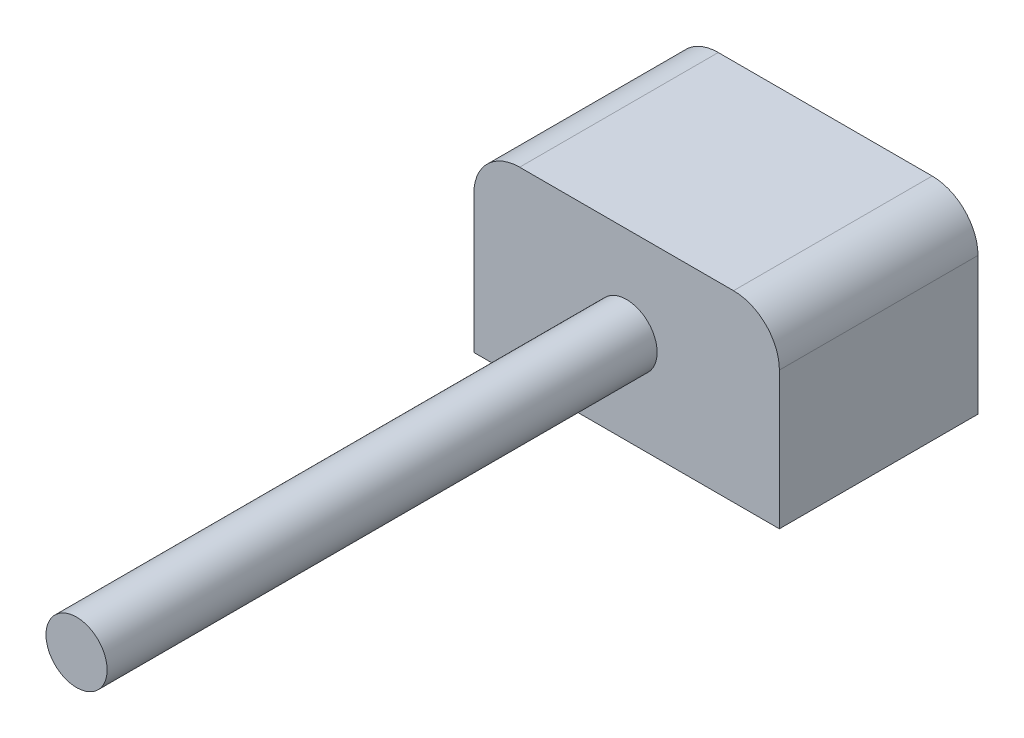
ISO-10303-21;
HEADER;
FILE_DESCRIPTION(('STEP AP214'),'2;1');
FILE_NAME('part.step','',(''),(''),'','','');
FILE_SCHEMA(('AUTOMOTIVE_DESIGN { 1 0 10303 214 1 1 1 1 }'));
ENDSEC;
DATA;
#1=APPLICATION_CONTEXT('core data for automotive mechanical design processes');
#2=APPLICATION_PROTOCOL_DEFINITION('international standard','automotive_design',2000,#1);
#3=PRODUCT_CONTEXT('',#1,'mechanical');
#4=PRODUCT('Part','Part','',(#3));
#5=PRODUCT_RELATED_PRODUCT_CATEGORY('part','',(#4));
#6=PRODUCT_DEFINITION_FORMATION('','',#4);
#7=PRODUCT_DEFINITION_CONTEXT('part definition',#1,'design');
#8=PRODUCT_DEFINITION('design','',#6,#7);
#9=PRODUCT_DEFINITION_SHAPE('','',#8);
#10=(LENGTH_UNIT() NAMED_UNIT(*) SI_UNIT(.MILLI.,.METRE.));
#11=(NAMED_UNIT(*) PLANE_ANGLE_UNIT() SI_UNIT($,.RADIAN.));
#12=(NAMED_UNIT(*) SI_UNIT($,.STERADIAN.) SOLID_ANGLE_UNIT());
#13=UNCERTAINTY_MEASURE_WITH_UNIT(LENGTH_MEASURE(1.E-05),#10,'distance_accuracy_value','');
#14=(GEOMETRIC_REPRESENTATION_CONTEXT(3) GLOBAL_UNCERTAINTY_ASSIGNED_CONTEXT((#13)) GLOBAL_UNIT_ASSIGNED_CONTEXT((#10,
#11,#12)) REPRESENTATION_CONTEXT('',''));
#15=CARTESIAN_POINT('',(0.,0.,0.));
#16=DIRECTION('',(0.,0.,1.));
#17=DIRECTION('',(1.,0.,0.));
#18=AXIS2_PLACEMENT_3D('',#15,#16,#17);
#19=CARTESIAN_POINT('',(-100.,60.,130.));
#20=DIRECTION('',(1.,0.,0.));
#21=DIRECTION('',(0.,1.,0.));
#22=AXIS2_PLACEMENT_3D('',#19,#20,#21);
#23=PLANE('',#22);
#24=DIRECTION('',(0.,-1.,0.));
#25=VECTOR('',#24,1.);
#26=CARTESIAN_POINT('',(-100.,60.,130.));
#27=LINE('',#26,#25);
#28=CARTESIAN_POINT('',(-100.,30.,130.));
#29=VERTEX_POINT('',#28);
#30=CARTESIAN_POINT('',(-100.,-60.,130.));
#31=VERTEX_POINT('',#30);
#32=EDGE_CURVE('E97',#29,#31,#27,.T.);
#33=ORIENTED_EDGE('',*,*,#32,.F.);
#34=DIRECTION('',(0.,0.,-1.));
#35=VECTOR('',#34,1.);
#36=CARTESIAN_POINT('',(-100.,30.,130.));
#37=LINE('',#36,#35);
#38=CARTESIAN_POINT('',(-100.,30.,0.));
#39=VERTEX_POINT('',#38);
#40=EDGE_CURVE('E13',#29,#39,#37,.T.);
#41=ORIENTED_EDGE('',*,*,#40,.T.);
#42=DIRECTION('',(0.,-1.,0.));
#43=VECTOR('',#42,1.);
#44=CARTESIAN_POINT('',(-100.,60.,0.));
#45=LINE('',#44,#43);
#46=CARTESIAN_POINT('',(-100.,-60.,0.));
#47=VERTEX_POINT('',#46);
#48=EDGE_CURVE('E116',#39,#47,#45,.T.);
#49=ORIENTED_EDGE('',*,*,#48,.T.);
#50=DIRECTION('',(0.,0.,-1.));
#51=VECTOR('',#50,1.);
#52=CARTESIAN_POINT('',(-100.,-60.,130.));
#53=LINE('',#52,#51);
#54=EDGE_CURVE('E110',#31,#47,#53,.T.);
#55=ORIENTED_EDGE('',*,*,#54,.F.);
#56=EDGE_LOOP('',(#33,#41,#49,#55));
#57=FACE_BOUND('',#56,.T.);
#58=ADVANCED_FACE('F44',(#57),#23,.F.);
#59=CARTESIAN_POINT('',(100.,-60.,130.));
#60=DIRECTION('',(0.,1.,0.));
#61=DIRECTION('',(-1.,0.,0.));
#62=AXIS2_PLACEMENT_3D('',#59,#60,#61);
#63=PLANE('',#62);
#64=DIRECTION('',(1.,0.,0.));
#65=VECTOR('',#64,1.);
#66=CARTESIAN_POINT('',(100.,-60.,0.));
#67=LINE('',#66,#65);
#68=CARTESIAN_POINT('',(100.,-60.,0.));
#69=VERTEX_POINT('',#68);
#70=EDGE_CURVE('E152',#47,#69,#67,.T.);
#71=ORIENTED_EDGE('',*,*,#70,.T.);
#72=DIRECTION('',(0.,0.,-1.));
#73=VECTOR('',#72,1.);
#74=CARTESIAN_POINT('',(100.,-60.,130.));
#75=LINE('',#74,#73);
#76=CARTESIAN_POINT('',(100.,-60.,130.));
#77=VERTEX_POINT('',#76);
#78=EDGE_CURVE('E112',#77,#69,#75,.T.);
#79=ORIENTED_EDGE('',*,*,#78,.F.);
#80=DIRECTION('',(1.,0.,0.));
#81=VECTOR('',#80,1.);
#82=CARTESIAN_POINT('',(100.,-60.,130.));
#83=LINE('',#82,#81);
#84=EDGE_CURVE('E100',#31,#77,#83,.T.);
#85=ORIENTED_EDGE('',*,*,#84,.F.);
#86=ORIENTED_EDGE('',*,*,#54,.T.);
#87=EDGE_LOOP('',(#71,#79,#85,#86));
#88=FACE_BOUND('',#87,.T.);
#89=ADVANCED_FACE('F109',(#88),#63,.F.);
#90=CARTESIAN_POINT('',(100.,60.,130.));
#91=DIRECTION('',(-1.,0.,0.));
#92=DIRECTION('',(0.,-1.,0.));
#93=AXIS2_PLACEMENT_3D('',#90,#91,#92);
#94=PLANE('',#93);
#95=DIRECTION('',(0.,1.,0.));
#96=VECTOR('',#95,1.);
#97=CARTESIAN_POINT('',(100.,60.,0.));
#98=LINE('',#97,#96);
#99=CARTESIAN_POINT('',(100.,30.,0.));
#100=VERTEX_POINT('',#99);
#101=EDGE_CURVE('E150',#69,#100,#98,.T.);
#102=ORIENTED_EDGE('',*,*,#101,.T.);
#103=DIRECTION('',(0.,0.,-1.));
#104=VECTOR('',#103,1.);
#105=CARTESIAN_POINT('',(100.,30.,130.));
#106=LINE('',#105,#104);
#107=CARTESIAN_POINT('',(100.,30.,130.));
#108=VERTEX_POINT('',#107);
#109=EDGE_CURVE('E67',#100,#108,#106,.F.);
#110=ORIENTED_EDGE('',*,*,#109,.T.);
#111=DIRECTION('',(0.,1.,0.));
#112=VECTOR('',#111,1.);
#113=CARTESIAN_POINT('',(100.,60.,130.));
#114=LINE('',#113,#112);
#115=EDGE_CURVE('E113',#77,#108,#114,.T.);
#116=ORIENTED_EDGE('',*,*,#115,.F.);
#117=ORIENTED_EDGE('',*,*,#78,.T.);
#118=EDGE_LOOP('',(#102,#110,#116,#117));
#119=FACE_BOUND('',#118,.T.);
#120=ADVANCED_FACE('F151',(#119),#94,.F.);
#121=CARTESIAN_POINT('',(100.,60.,130.));
#122=DIRECTION('',(0.,-1.,0.));
#123=DIRECTION('',(1.,0.,0.));
#124=AXIS2_PLACEMENT_3D('',#121,#122,#123);
#125=PLANE('',#124);
#126=DIRECTION('',(-1.,0.,0.));
#127=VECTOR('',#126,1.);
#128=CARTESIAN_POINT('',(100.,60.,130.));
#129=LINE('',#128,#127);
#130=CARTESIAN_POINT('',(70.,60.,130.));
#131=VERTEX_POINT('',#130);
#132=CARTESIAN_POINT('',(-70.,60.,130.));
#133=VERTEX_POINT('',#132);
#134=EDGE_CURVE('E123',#131,#133,#129,.T.);
#135=ORIENTED_EDGE('',*,*,#134,.F.);
#136=DIRECTION('',(0.,0.,-1.));
#137=VECTOR('',#136,1.);
#138=CARTESIAN_POINT('',(70.,60.,130.));
#139=LINE('',#138,#137);
#140=CARTESIAN_POINT('',(70.,60.,0.));
#141=VERTEX_POINT('',#140);
#142=EDGE_CURVE('E128',#131,#141,#139,.T.);
#143=ORIENTED_EDGE('',*,*,#142,.T.);
#144=DIRECTION('',(-1.,0.,0.));
#145=VECTOR('',#144,1.);
#146=CARTESIAN_POINT('',(100.,60.,0.));
#147=LINE('',#146,#145);
#148=CARTESIAN_POINT('',(-70.,60.,0.));
#149=VERTEX_POINT('',#148);
#150=EDGE_CURVE('E105',#141,#149,#147,.T.);
#151=ORIENTED_EDGE('',*,*,#150,.T.);
#152=DIRECTION('',(0.,0.,-1.));
#153=VECTOR('',#152,1.);
#154=CARTESIAN_POINT('',(-70.,60.,130.));
#155=LINE('',#154,#153);
#156=EDGE_CURVE('E121',#149,#133,#155,.F.);
#157=ORIENTED_EDGE('',*,*,#156,.T.);
#158=EDGE_LOOP('',(#135,#143,#151,#157));
#159=FACE_BOUND('',#158,.T.);
#160=ADVANCED_FACE('F141',(#159),#125,.F.);
#161=CARTESIAN_POINT('',(0.,0.,130.));
#162=DIRECTION('',(0.,0.,-1.));
#163=DIRECTION('',(-1.,0.,0.));
#164=AXIS2_PLACEMENT_3D('',#161,#162,#163);
#165=PLANE('',#164);
#166=CARTESIAN_POINT('',(0.,0.,130.));
#167=DIRECTION('',(0.,0.,1.));
#168=DIRECTION('',(1.,0.,0.));
#169=AXIS2_PLACEMENT_3D('',#166,#167,#168);
#170=CIRCLE('',#169,20.);
#171=CARTESIAN_POINT('',(-20.,0.,130.));
#172=VERTEX_POINT('',#171);
#173=EDGE_CURVE('E118',#172,#172,#170,.T.);
#174=ORIENTED_EDGE('',*,*,#173,.F.);
#175=EDGE_LOOP('',(#174));
#176=FACE_BOUND('',#175,.T.);
#177=ORIENTED_EDGE('',*,*,#115,.T.);
#178=CARTESIAN_POINT('',(70.,30.,130.));
#179=DIRECTION('',(0.,0.,-1.));
#180=DIRECTION('',(-1.,0.,0.));
#181=AXIS2_PLACEMENT_3D('',#178,#179,#180);
#182=CIRCLE('',#181,30.);
#183=EDGE_CURVE('E52',#108,#131,#182,.F.);
#184=ORIENTED_EDGE('',*,*,#183,.T.);
#185=ORIENTED_EDGE('',*,*,#134,.T.);
#186=CARTESIAN_POINT('',(-70.,30.,130.));
#187=DIRECTION('',(0.,0.,-1.));
#188=DIRECTION('',(-1.,0.,0.));
#189=AXIS2_PLACEMENT_3D('',#186,#187,#188);
#190=CIRCLE('',#189,30.);
#191=EDGE_CURVE('E59',#133,#29,#190,.F.);
#192=ORIENTED_EDGE('',*,*,#191,.T.);
#193=ORIENTED_EDGE('',*,*,#32,.T.);
#194=ORIENTED_EDGE('',*,*,#84,.T.);
#195=EDGE_LOOP('',(#177,#184,#185,#192,#193,#194));
#196=FACE_BOUND('',#195,.T.);
#197=ADVANCED_FACE('F99',(#176,#196),#165,.F.);
#198=CARTESIAN_POINT('',(0.,0.,0.));
#199=DIRECTION('',(0.,0.,-1.));
#200=DIRECTION('',(-1.,0.,0.));
#201=AXIS2_PLACEMENT_3D('',#198,#199,#200);
#202=PLANE('',#201);
#203=ORIENTED_EDGE('',*,*,#150,.F.);
#204=CARTESIAN_POINT('',(70.,30.,0.));
#205=DIRECTION('',(0.,0.,-1.));
#206=DIRECTION('',(-1.,0.,0.));
#207=AXIS2_PLACEMENT_3D('',#204,#205,#206);
#208=CIRCLE('',#207,30.);
#209=EDGE_CURVE('E133',#141,#100,#208,.T.);
#210=ORIENTED_EDGE('',*,*,#209,.T.);
#211=ORIENTED_EDGE('',*,*,#101,.F.);
#212=ORIENTED_EDGE('',*,*,#70,.F.);
#213=ORIENTED_EDGE('',*,*,#48,.F.);
#214=CARTESIAN_POINT('',(-70.,30.,0.));
#215=DIRECTION('',(0.,0.,-1.));
#216=DIRECTION('',(-1.,0.,0.));
#217=AXIS2_PLACEMENT_3D('',#214,#215,#216);
#218=CIRCLE('',#217,30.);
#219=EDGE_CURVE('E131',#39,#149,#218,.T.);
#220=ORIENTED_EDGE('',*,*,#219,.T.);
#221=EDGE_LOOP('',(#203,#210,#211,#212,#213,#220));
#222=FACE_BOUND('',#221,.T.);
#223=ADVANCED_FACE('F149',(#222),#202,.T.);
#224=CARTESIAN_POINT('',(0.,0.,490.));
#225=DIRECTION('',(0.,0.,-1.));
#226=DIRECTION('',(-1.,0.,0.));
#227=AXIS2_PLACEMENT_3D('',#224,#225,#226);
#228=CYLINDRICAL_SURFACE('',#227,20.);
#229=CARTESIAN_POINT('',(0.,0.,490.));
#230=DIRECTION('',(0.,0.,1.));
#231=DIRECTION('',(1.,0.,0.));
#232=AXIS2_PLACEMENT_3D('',#229,#230,#231);
#233=CIRCLE('',#232,20.);
#234=CARTESIAN_POINT('',(-20.,0.,490.));
#235=VERTEX_POINT('',#234);
#236=EDGE_CURVE('E156',#235,#235,#233,.T.);
#237=CARTESIAN_POINT('',(-20.,0.,490.));
#238=CARTESIAN_POINT('',(-20.,0.,486.25));
#239=CARTESIAN_POINT('',(-20.,0.,482.5));
#240=CARTESIAN_POINT('',(-20.,0.,475.));
#241=CARTESIAN_POINT('',(-20.,0.,471.25));
#242=CARTESIAN_POINT('',(-20.,0.,463.75));
#243=CARTESIAN_POINT('',(-20.,0.,460.));
#244=CARTESIAN_POINT('',(-20.,0.,452.5));
#245=CARTESIAN_POINT('',(-20.,0.,448.75));
#246=CARTESIAN_POINT('',(-20.,0.,441.25));
#247=CARTESIAN_POINT('',(-20.,0.,437.5));
#248=CARTESIAN_POINT('',(-20.,0.,430.));
#249=CARTESIAN_POINT('',(-20.,0.,426.25));
#250=CARTESIAN_POINT('',(-20.,0.,418.75));
#251=CARTESIAN_POINT('',(-20.,0.,415.));
#252=CARTESIAN_POINT('',(-20.,0.,407.5));
#253=CARTESIAN_POINT('',(-20.,0.,403.75));
#254=CARTESIAN_POINT('',(-20.,0.,396.25));
#255=CARTESIAN_POINT('',(-20.,0.,392.5));
#256=CARTESIAN_POINT('',(-20.,0.,385.));
#257=CARTESIAN_POINT('',(-20.,0.,381.25));
#258=CARTESIAN_POINT('',(-20.,0.,373.75));
#259=CARTESIAN_POINT('',(-20.,0.,370.));
#260=CARTESIAN_POINT('',(-20.,0.,362.5));
#261=CARTESIAN_POINT('',(-20.,0.,358.75));
#262=CARTESIAN_POINT('',(-20.,0.,351.25));
#263=CARTESIAN_POINT('',(-20.,0.,347.5));
#264=CARTESIAN_POINT('',(-20.,0.,340.));
#265=CARTESIAN_POINT('',(-20.,0.,336.25));
#266=CARTESIAN_POINT('',(-20.,0.,328.75));
#267=CARTESIAN_POINT('',(-20.,0.,325.));
#268=CARTESIAN_POINT('',(-20.,0.,317.5));
#269=CARTESIAN_POINT('',(-20.,0.,313.75));
#270=CARTESIAN_POINT('',(-20.,0.,306.25));
#271=CARTESIAN_POINT('',(-20.,0.,302.5));
#272=CARTESIAN_POINT('',(-20.,0.,295.));
#273=CARTESIAN_POINT('',(-20.,0.,291.25));
#274=CARTESIAN_POINT('',(-20.,0.,283.75));
#275=CARTESIAN_POINT('',(-20.,0.,280.));
#276=CARTESIAN_POINT('',(-20.,0.,272.5));
#277=CARTESIAN_POINT('',(-20.,0.,268.75));
#278=CARTESIAN_POINT('',(-20.,0.,261.25));
#279=CARTESIAN_POINT('',(-20.,0.,257.5));
#280=CARTESIAN_POINT('',(-20.,0.,250.));
#281=CARTESIAN_POINT('',(-20.,0.,246.25));
#282=CARTESIAN_POINT('',(-20.,0.,238.75));
#283=CARTESIAN_POINT('',(-20.,0.,235.));
#284=CARTESIAN_POINT('',(-20.,0.,227.5));
#285=CARTESIAN_POINT('',(-20.,0.,223.75));
#286=CARTESIAN_POINT('',(-20.,0.,216.25));
#287=CARTESIAN_POINT('',(-20.,0.,212.5));
#288=CARTESIAN_POINT('',(-20.,0.,205.));
#289=CARTESIAN_POINT('',(-20.,0.,201.25));
#290=CARTESIAN_POINT('',(-20.,0.,193.75));
#291=CARTESIAN_POINT('',(-20.,0.,190.));
#292=CARTESIAN_POINT('',(-20.,0.,182.5));
#293=CARTESIAN_POINT('',(-20.,0.,178.75));
#294=CARTESIAN_POINT('',(-20.,0.,171.25));
#295=CARTESIAN_POINT('',(-20.,0.,167.5));
#296=CARTESIAN_POINT('',(-20.,0.,160.));
#297=CARTESIAN_POINT('',(-20.,0.,156.25));
#298=CARTESIAN_POINT('',(-20.,0.,148.75));
#299=CARTESIAN_POINT('',(-20.,0.,145.));
#300=CARTESIAN_POINT('',(-20.,0.,137.5));
#301=CARTESIAN_POINT('',(-20.,0.,133.75));
#302=CARTESIAN_POINT('',(-20.,0.,130.));
#303=B_SPLINE_CURVE_WITH_KNOTS('',3,(#237,#238,#239,#240,#241,#242,#243,#244,#245,#246,#247,
#248,#249,#250,#251,#252,#253,#254,#255,#256,#257,#258,#259,#260,#261,#262,#263,#264,#265,#266,
#267,#268,#269,#270,#271,#272,#273,#274,#275,#276,#277,#278,#279,#280,#281,#282,#283,#284,#285,
#286,#287,#288,#289,#290,#291,#292,#293,#294,#295,#296,#297,#298,#299,#300,#301,#302),
.UNSPECIFIED.,.F.,.F.,(4,2,2,2,2,2,2,2,2,2,2,2,2,2,2,2,2,2,2,2,2,2,2,2,2,2,2,2,2,2,2,2,4),(0.,
11.25,22.5,33.7499999999999,45.,56.25,67.4999999999999,78.75,90.,101.25,112.5,123.75,135.,
146.25,157.5,168.75,180.,191.25,202.5,213.75,225.,236.25,247.5,258.75,270.,281.25,292.5,303.75,
315.,326.25,337.5,348.75,360.),.UNSPECIFIED.);
#304=EDGE_CURVE('BSEAM164',#235,#172,#303,.T.);
#305=ORIENTED_EDGE('',*,*,#236,.F.);
#306=ORIENTED_EDGE('',*,*,#173,.T.);
#307=ORIENTED_EDGE('',*,*,#304,.T.);
#308=ORIENTED_EDGE('',*,*,#304,.F.);
#309=EDGE_LOOP('',(#305,#307,#306,#308));
#310=FACE_BOUND('',#309,.T.);
#311=ADVANCED_FACE('F164',(#310),#228,.T.);
#312=CARTESIAN_POINT('',(0.,0.,490.));
#313=DIRECTION('',(0.,0.,1.));
#314=DIRECTION('',(1.,0.,0.));
#315=AXIS2_PLACEMENT_3D('',#312,#313,#314);
#316=PLANE('',#315);
#317=ORIENTED_EDGE('',*,*,#236,.T.);
#318=EDGE_LOOP('',(#317));
#319=FACE_BOUND('',#318,.T.);
#320=ADVANCED_FACE('F162',(#319),#316,.T.);
#321=CARTESIAN_POINT('',(70.,30.,130.));
#322=DIRECTION('',(0.,0.,-1.));
#323=DIRECTION('',(-1.,0.,0.));
#324=AXIS2_PLACEMENT_3D('',#321,#322,#323);
#325=CYLINDRICAL_SURFACE('',#324,30.);
#326=ORIENTED_EDGE('',*,*,#183,.F.);
#327=ORIENTED_EDGE('',*,*,#109,.F.);
#328=ORIENTED_EDGE('',*,*,#209,.F.);
#329=ORIENTED_EDGE('',*,*,#142,.F.);
#330=EDGE_LOOP('',(#326,#327,#328,#329));
#331=FACE_BOUND('',#330,.T.);
#332=ADVANCED_FACE('F146',(#331),#325,.T.);
#333=CARTESIAN_POINT('',(-70.,30.,130.));
#334=DIRECTION('',(0.,0.,-1.));
#335=DIRECTION('',(-1.,0.,0.));
#336=AXIS2_PLACEMENT_3D('',#333,#334,#335);
#337=CYLINDRICAL_SURFACE('',#336,30.);
#338=ORIENTED_EDGE('',*,*,#191,.F.);
#339=ORIENTED_EDGE('',*,*,#156,.F.);
#340=ORIENTED_EDGE('',*,*,#219,.F.);
#341=ORIENTED_EDGE('',*,*,#40,.F.);
#342=EDGE_LOOP('',(#338,#339,#340,#341));
#343=FACE_BOUND('',#342,.T.);
#344=ADVANCED_FACE('F46',(#343),#337,.T.);
#345=CLOSED_SHELL('',(#58,#89,#120,#160,#197,#223,#311,#320,#332,#344));
#346=MANIFOLD_SOLID_BREP('B2',#345);
#347=ADVANCED_BREP_SHAPE_REPRESENTATION('',(#18,#346),#14);
#348=SHAPE_DEFINITION_REPRESENTATION(#9,#347);
ENDSEC;
END-ISO-10303-21;
